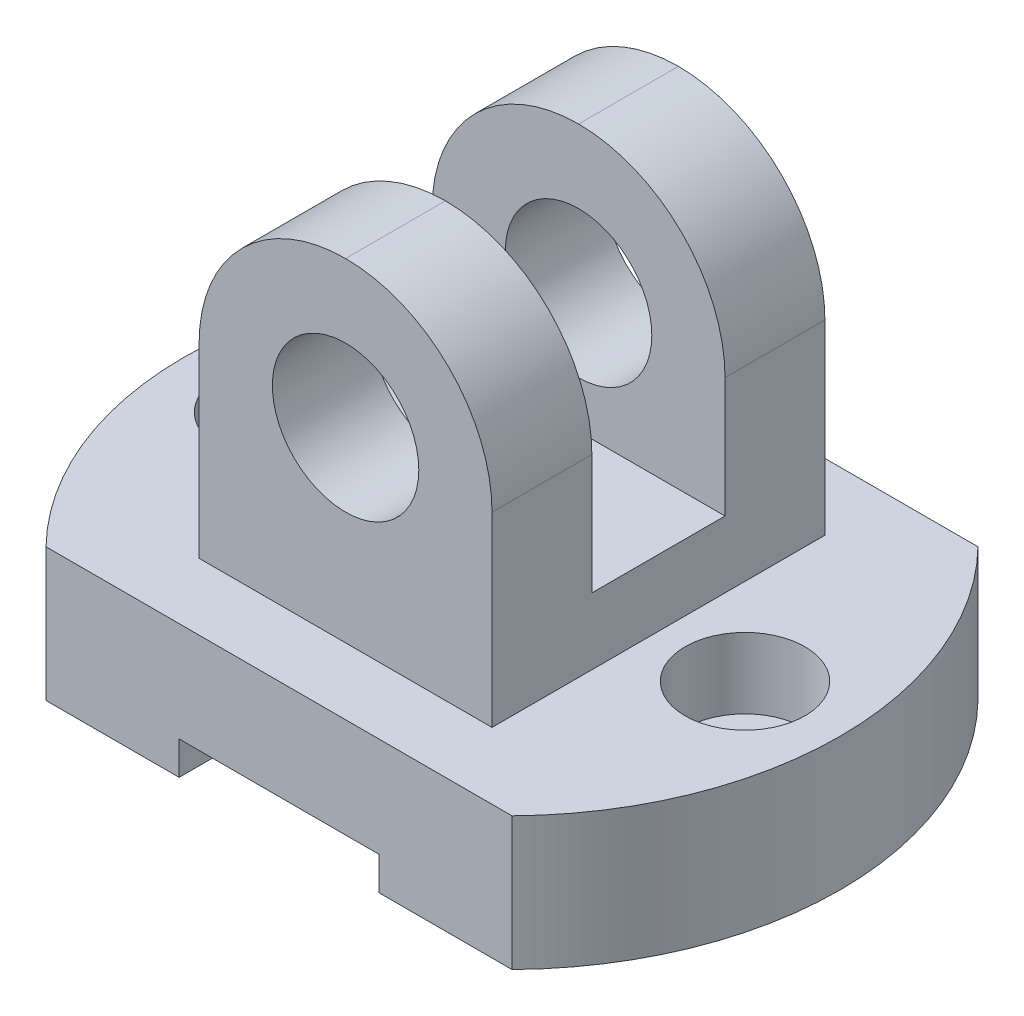
ISO-10303-21;
HEADER;
FILE_DESCRIPTION(('STEP AP214'),'2;1');
FILE_NAME('part.step','',(''),(''),'','','');
FILE_SCHEMA(('AUTOMOTIVE_DESIGN { 1 0 10303 214 1 1 1 1 }'));
ENDSEC;
DATA;
#1=APPLICATION_CONTEXT('core data for automotive mechanical design processes');
#2=APPLICATION_PROTOCOL_DEFINITION('international standard','automotive_design',2000,#1);
#3=PRODUCT_CONTEXT('',#1,'mechanical');
#4=PRODUCT('Part','Part','',(#3));
#5=PRODUCT_RELATED_PRODUCT_CATEGORY('part','',(#4));
#6=PRODUCT_DEFINITION_FORMATION('','',#4);
#7=PRODUCT_DEFINITION_CONTEXT('part definition',#1,'design');
#8=PRODUCT_DEFINITION('design','',#6,#7);
#9=PRODUCT_DEFINITION_SHAPE('','',#8);
#10=(LENGTH_UNIT() NAMED_UNIT(*) SI_UNIT(.MILLI.,.METRE.));
#11=(NAMED_UNIT(*) PLANE_ANGLE_UNIT() SI_UNIT($,.RADIAN.));
#12=(NAMED_UNIT(*) SI_UNIT($,.STERADIAN.) SOLID_ANGLE_UNIT());
#13=UNCERTAINTY_MEASURE_WITH_UNIT(LENGTH_MEASURE(1.E-05),#10,'distance_accuracy_value','');
#14=(GEOMETRIC_REPRESENTATION_CONTEXT(3) GLOBAL_UNCERTAINTY_ASSIGNED_CONTEXT((#13)) GLOBAL_UNIT_ASSIGNED_CONTEXT((#10,
#11,#12)) REPRESENTATION_CONTEXT('',''));
#15=CARTESIAN_POINT('',(0.,0.,0.));
#16=DIRECTION('',(0.,0.,1.));
#17=DIRECTION('',(1.,0.,0.));
#18=AXIS2_PLACEMENT_3D('',#15,#16,#17);
#19=CARTESIAN_POINT('',(22.,30.,0.));
#20=DIRECTION('',(0.,-1.,0.));
#21=DIRECTION('',(0.,0.,-1.));
#22=AXIS2_PLACEMENT_3D('',#19,#20,#21);
#23=PLANE('',#22);
#24=DIRECTION('',(0.,0.,1.));
#25=VECTOR('',#24,1.);
#26=CARTESIAN_POINT('',(-22.,30.,0.));
#27=LINE('',#26,#25);
#28=CARTESIAN_POINT('',(-22.,30.,-10.));
#29=VERTEX_POINT('',#28);
#30=CARTESIAN_POINT('',(-22.,30.,10.));
#31=VERTEX_POINT('',#30);
#32=EDGE_CURVE('E250',#29,#31,#27,.T.);
#33=ORIENTED_EDGE('',*,*,#32,.T.);
#34=DIRECTION('',(-1.,0.,0.));
#35=VECTOR('',#34,1.);
#36=CARTESIAN_POINT('',(22.,30.,10.));
#37=LINE('',#36,#35);
#38=CARTESIAN_POINT('',(22.,30.,10.));
#39=VERTEX_POINT('',#38);
#40=EDGE_CURVE('E267',#39,#31,#37,.T.);
#41=ORIENTED_EDGE('',*,*,#40,.F.);
#42=DIRECTION('',(0.,0.,1.));
#43=VECTOR('',#42,1.);
#44=CARTESIAN_POINT('',(22.,30.,0.));
#45=LINE('',#44,#43);
#46=CARTESIAN_POINT('',(22.,30.,-10.));
#47=VERTEX_POINT('',#46);
#48=EDGE_CURVE('E313',#47,#39,#45,.T.);
#49=ORIENTED_EDGE('',*,*,#48,.F.);
#50=DIRECTION('',(-1.,0.,0.));
#51=VECTOR('',#50,1.);
#52=CARTESIAN_POINT('',(22.,30.,-10.));
#53=LINE('',#52,#51);
#54=EDGE_CURVE('E271',#47,#29,#53,.T.);
#55=ORIENTED_EDGE('',*,*,#54,.T.);
#56=EDGE_LOOP('',(#33,#41,#49,#55));
#57=FACE_BOUND('',#56,.T.);
#58=CARTESIAN_POINT('',(0.,30.,0.));
#59=DIRECTION('',(0.,1.,0.));
#60=DIRECTION('',(0.,0.,1.));
#61=AXIS2_PLACEMENT_3D('',#58,#59,#60);
#62=CIRCLE('',#61,8.);
#63=CARTESIAN_POINT('',(0.,30.,8.));
#64=VERTEX_POINT('',#63);
#65=EDGE_CURVE('E227',#64,#64,#62,.T.);
#66=ORIENTED_EDGE('',*,*,#65,.F.);
#67=EDGE_LOOP('',(#66));
#68=FACE_BOUND('',#67,.T.);
#69=ADVANCED_FACE('F41',(#57,#68),#23,.F.);
#70=CARTESIAN_POINT('',(35.,0.,0.));
#71=DIRECTION('',(0.,1.,0.));
#72=DIRECTION('',(0.,0.,1.));
#73=AXIS2_PLACEMENT_3D('',#70,#71,#72);
#74=PLANE('',#73);
#75=CARTESIAN_POINT('',(35.,0.,0.));
#76=DIRECTION('',(0.,1.,0.));
#77=DIRECTION('',(0.,0.,1.));
#78=AXIS2_PLACEMENT_3D('',#75,#76,#77);
#79=CIRCLE('',#78,5.5);
#80=CARTESIAN_POINT('',(35.,0.,5.5));
#81=VERTEX_POINT('',#80);
#82=EDGE_CURVE('E735',#81,#81,#79,.T.);
#83=ORIENTED_EDGE('',*,*,#82,.T.);
#84=EDGE_LOOP('',(#83));
#85=FACE_BOUND('',#84,.T.);
#86=DIRECTION('',(0.,0.,1.));
#87=VECTOR('',#86,1.);
#88=CARTESIAN_POINT('',(15.,1.25466176937855E-13,-209.638659733079));
#89=LINE('',#88,#87);
#90=CARTESIAN_POINT('',(15.,0.,-35.));
#91=VERTEX_POINT('',#90);
#92=CARTESIAN_POINT('',(15.,0.,35.));
#93=VERTEX_POINT('',#92);
#94=EDGE_CURVE('E718',#91,#93,#89,.T.);
#95=ORIENTED_EDGE('',*,*,#94,.F.);
#96=DIRECTION('',(-1.,0.,0.));
#97=VECTOR('',#96,1.);
#98=CARTESIAN_POINT('',(35.,0.,-35.));
#99=LINE('',#98,#97);
#100=CARTESIAN_POINT('',(35.,0.,-35.));
#101=VERTEX_POINT('',#100);
#102=EDGE_CURVE('E194',#101,#91,#99,.T.);
#103=ORIENTED_EDGE('',*,*,#102,.F.);
#104=CARTESIAN_POINT('',(-0.707142142714244,0.,0.));
#105=DIRECTION('',(0.,-1.,0.));
#106=DIRECTION('',(0.,0.,1.));
#107=AXIS2_PLACEMENT_3D('',#104,#105,#106);
#108=CIRCLE('',#107,50.);
#109=CARTESIAN_POINT('',(35.,0.,35.));
#110=VERTEX_POINT('',#109);
#111=EDGE_CURVE('E298',#101,#110,#108,.T.);
#112=ORIENTED_EDGE('',*,*,#111,.T.);
#113=DIRECTION('',(-1.,0.,0.));
#114=VECTOR('',#113,1.);
#115=CARTESIAN_POINT('',(35.,0.,35.));
#116=LINE('',#115,#114);
#117=EDGE_CURVE('E177',#110,#93,#116,.T.);
#118=ORIENTED_EDGE('',*,*,#117,.T.);
#119=EDGE_LOOP('',(#95,#103,#112,#118));
#120=FACE_BOUND('',#119,.T.);
#121=ADVANCED_FACE('F360',(#85,#120),#74,.F.);
#122=CARTESIAN_POINT('',(35.,0.,-35.));
#123=DIRECTION('',(0.,0.,-1.));
#124=DIRECTION('',(0.,1.,0.));
#125=AXIS2_PLACEMENT_3D('',#122,#123,#124);
#126=PLANE('',#125);
#127=ORIENTED_EDGE('',*,*,#102,.T.);
#128=DIRECTION('',(0.,1.,0.));
#129=VECTOR('',#128,1.);
#130=CARTESIAN_POINT('',(15.,0.,-35.));
#131=LINE('',#130,#129);
#132=CARTESIAN_POINT('',(15.,5.,-35.));
#133=VERTEX_POINT('',#132);
#134=EDGE_CURVE('E712',#91,#133,#131,.T.);
#135=ORIENTED_EDGE('',*,*,#134,.T.);
#136=DIRECTION('',(-1.,0.,0.));
#137=VECTOR('',#136,1.);
#138=CARTESIAN_POINT('',(35.,5.,-35.));
#139=LINE('',#138,#137);
#140=CARTESIAN_POINT('',(-15.,5.00000000000013,-35.));
#141=VERTEX_POINT('',#140);
#142=EDGE_CURVE('E715',#133,#141,#139,.T.);
#143=ORIENTED_EDGE('',*,*,#142,.T.);
#144=DIRECTION('',(0.,-1.,0.));
#145=VECTOR('',#144,1.);
#146=CARTESIAN_POINT('',(-15.,0.,-35.));
#147=LINE('',#146,#145);
#148=CARTESIAN_POINT('',(-15.,0.,-35.));
#149=VERTEX_POINT('',#148);
#150=EDGE_CURVE('E294',#141,#149,#147,.T.);
#151=ORIENTED_EDGE('',*,*,#150,.T.);
#152=CARTESIAN_POINT('',(-35.,0.,-35.));
#153=VERTEX_POINT('',#152);
#154=EDGE_CURVE('E184',#149,#153,#99,.T.);
#155=ORIENTED_EDGE('',*,*,#154,.T.);
#156=DIRECTION('',(0.,-1.,0.));
#157=VECTOR('',#156,1.);
#158=CARTESIAN_POINT('',(-35.,0.,-35.));
#159=LINE('',#158,#157);
#160=CARTESIAN_POINT('',(-35.,20.,-35.));
#161=VERTEX_POINT('',#160);
#162=EDGE_CURVE('E276',#161,#153,#159,.T.);
#163=ORIENTED_EDGE('',*,*,#162,.F.);
#164=DIRECTION('',(-1.,0.,0.));
#165=VECTOR('',#164,1.);
#166=CARTESIAN_POINT('',(35.,20.,-35.));
#167=LINE('',#166,#165);
#168=CARTESIAN_POINT('',(35.,20.,-35.));
#169=VERTEX_POINT('',#168);
#170=EDGE_CURVE('E286',#169,#161,#167,.T.);
#171=ORIENTED_EDGE('',*,*,#170,.F.);
#172=DIRECTION('',(0.,-1.,0.));
#173=VECTOR('',#172,1.);
#174=CARTESIAN_POINT('',(35.,0.,-35.));
#175=LINE('',#174,#173);
#176=EDGE_CURVE('E277',#169,#101,#175,.T.);
#177=ORIENTED_EDGE('',*,*,#176,.T.);
#178=EDGE_LOOP('',(#127,#135,#143,#151,#155,#163,#171,#177));
#179=FACE_BOUND('',#178,.T.);
#180=ADVANCED_FACE('F293',(#179),#126,.T.);
#181=CARTESIAN_POINT('',(35.,0.,35.));
#182=DIRECTION('',(0.,0.,-1.));
#183=DIRECTION('',(-1.,0.,0.));
#184=AXIS2_PLACEMENT_3D('',#181,#182,#183);
#185=PLANE('',#184);
#186=DIRECTION('',(0.,1.,0.));
#187=VECTOR('',#186,1.);
#188=CARTESIAN_POINT('',(15.,0.,35.));
#189=LINE('',#188,#187);
#190=CARTESIAN_POINT('',(15.,4.99999999999996,35.));
#191=VERTEX_POINT('',#190);
#192=EDGE_CURVE('E196',#93,#191,#189,.T.);
#193=ORIENTED_EDGE('',*,*,#192,.F.);
#194=ORIENTED_EDGE('',*,*,#117,.F.);
#195=DIRECTION('',(0.,-1.,0.));
#196=VECTOR('',#195,1.);
#197=CARTESIAN_POINT('',(35.,0.,35.));
#198=LINE('',#197,#196);
#199=CARTESIAN_POINT('',(35.,20.,35.));
#200=VERTEX_POINT('',#199);
#201=EDGE_CURVE('E178',#200,#110,#198,.T.);
#202=ORIENTED_EDGE('',*,*,#201,.F.);
#203=DIRECTION('',(-1.,0.,0.));
#204=VECTOR('',#203,1.);
#205=CARTESIAN_POINT('',(35.,20.,35.));
#206=LINE('',#205,#204);
#207=CARTESIAN_POINT('',(-35.,20.,35.));
#208=VERTEX_POINT('',#207);
#209=EDGE_CURVE('E285',#200,#208,#206,.T.);
#210=ORIENTED_EDGE('',*,*,#209,.T.);
#211=DIRECTION('',(0.,-1.,0.));
#212=VECTOR('',#211,1.);
#213=CARTESIAN_POINT('',(-35.,0.,35.));
#214=LINE('',#213,#212);
#215=CARTESIAN_POINT('',(-35.,0.,35.));
#216=VERTEX_POINT('',#215);
#217=EDGE_CURVE('E173',#208,#216,#214,.T.);
#218=ORIENTED_EDGE('',*,*,#217,.T.);
#219=CARTESIAN_POINT('',(-15.,0.,35.));
#220=VERTEX_POINT('',#219);
#221=EDGE_CURVE('E166',#220,#216,#116,.T.);
#222=ORIENTED_EDGE('',*,*,#221,.F.);
#223=DIRECTION('',(0.,-1.,0.));
#224=VECTOR('',#223,1.);
#225=CARTESIAN_POINT('',(-15.,0.,35.));
#226=LINE('',#225,#224);
#227=CARTESIAN_POINT('',(-15.,5.00000000000013,35.));
#228=VERTEX_POINT('',#227);
#229=EDGE_CURVE('E170',#228,#220,#226,.T.);
#230=ORIENTED_EDGE('',*,*,#229,.F.);
#231=DIRECTION('',(-1.,0.,0.));
#232=VECTOR('',#231,1.);
#233=CARTESIAN_POINT('',(35.,4.99999999999996,35.));
#234=LINE('',#233,#232);
#235=EDGE_CURVE('E193',#191,#228,#234,.T.);
#236=ORIENTED_EDGE('',*,*,#235,.F.);
#237=EDGE_LOOP('',(#193,#194,#202,#210,#218,#222,#230,#236));
#238=FACE_BOUND('',#237,.T.);
#239=ADVANCED_FACE('F168',(#238),#185,.F.);
#240=CARTESIAN_POINT('',(35.,20.,0.));
#241=DIRECTION('',(0.,1.,0.));
#242=DIRECTION('',(0.,0.,1.));
#243=AXIS2_PLACEMENT_3D('',#240,#241,#242);
#244=PLANE('',#243);
#245=CARTESIAN_POINT('',(-35.,20.,0.));
#246=DIRECTION('',(0.,1.,0.));
#247=DIRECTION('',(0.,0.,1.));
#248=AXIS2_PLACEMENT_3D('',#245,#246,#247);
#249=CIRCLE('',#248,9.);
#250=CARTESIAN_POINT('',(-35.,20.,9.00000000000001));
#251=VERTEX_POINT('',#250);
#252=EDGE_CURVE('E756',#251,#251,#249,.T.);
#253=ORIENTED_EDGE('',*,*,#252,.F.);
#254=EDGE_LOOP('',(#253));
#255=FACE_BOUND('',#254,.T.);
#256=CARTESIAN_POINT('',(35.,20.,0.));
#257=DIRECTION('',(0.,1.,0.));
#258=DIRECTION('',(0.,0.,1.));
#259=AXIS2_PLACEMENT_3D('',#256,#257,#258);
#260=CIRCLE('',#259,9.);
#261=CARTESIAN_POINT('',(35.,20.,9.00000000000001));
#262=VERTEX_POINT('',#261);
#263=EDGE_CURVE('E744',#262,#262,#260,.T.);
#264=ORIENTED_EDGE('',*,*,#263,.F.);
#265=EDGE_LOOP('',(#264));
#266=FACE_BOUND('',#265,.T.);
#267=ORIENTED_EDGE('',*,*,#170,.T.);
#268=CARTESIAN_POINT('',(0.707142142714244,20.,0.));
#269=DIRECTION('',(0.,-1.,0.));
#270=DIRECTION('',(0.,0.,-1.));
#271=AXIS2_PLACEMENT_3D('',#268,#269,#270);
#272=CIRCLE('',#271,50.);
#273=EDGE_CURVE('E297',#208,#161,#272,.T.);
#274=ORIENTED_EDGE('',*,*,#273,.F.);
#275=ORIENTED_EDGE('',*,*,#209,.F.);
#276=CARTESIAN_POINT('',(-0.707142142714244,20.,0.));
#277=DIRECTION('',(0.,-1.,0.));
#278=DIRECTION('',(0.,0.,1.));
#279=AXIS2_PLACEMENT_3D('',#276,#277,#278);
#280=CIRCLE('',#279,50.);
#281=EDGE_CURVE('E304',#169,#200,#280,.T.);
#282=ORIENTED_EDGE('',*,*,#281,.F.);
#283=EDGE_LOOP('',(#267,#274,#275,#282));
#284=FACE_BOUND('',#283,.T.);
#285=DIRECTION('',(-1.,0.,0.));
#286=VECTOR('',#285,1.);
#287=CARTESIAN_POINT('',(22.,20.,25.));
#288=LINE('',#287,#286);
#289=CARTESIAN_POINT('',(22.,20.,25.));
#290=VERTEX_POINT('',#289);
#291=CARTESIAN_POINT('',(-22.,20.,25.));
#292=VERTEX_POINT('',#291);
#293=EDGE_CURVE('E264',#290,#292,#288,.T.);
#294=ORIENTED_EDGE('',*,*,#293,.T.);
#295=DIRECTION('',(0.,0.,-1.));
#296=VECTOR('',#295,1.);
#297=CARTESIAN_POINT('',(-22.,20.,0.));
#298=LINE('',#297,#296);
#299=CARTESIAN_POINT('',(-22.,20.,-25.));
#300=VERTEX_POINT('',#299);
#301=EDGE_CURVE('E255',#292,#300,#298,.T.);
#302=ORIENTED_EDGE('',*,*,#301,.T.);
#303=DIRECTION('',(-1.,0.,0.));
#304=VECTOR('',#303,1.);
#305=CARTESIAN_POINT('',(22.,20.,-25.));
#306=LINE('',#305,#304);
#307=CARTESIAN_POINT('',(22.,20.,-25.));
#308=VERTEX_POINT('',#307);
#309=EDGE_CURVE('E273',#308,#300,#306,.T.);
#310=ORIENTED_EDGE('',*,*,#309,.F.);
#311=DIRECTION('',(0.,0.,-1.));
#312=VECTOR('',#311,1.);
#313=CARTESIAN_POINT('',(22.,20.,0.));
#314=LINE('',#313,#312);
#315=EDGE_CURVE('E263',#290,#308,#314,.T.);
#316=ORIENTED_EDGE('',*,*,#315,.F.);
#317=EDGE_LOOP('',(#294,#302,#310,#316));
#318=FACE_BOUND('',#317,.T.);
#319=ADVANCED_FACE('F331',(#255,#266,#284,#318),#244,.T.);
#320=CARTESIAN_POINT('',(-35.,0.,0.));
#321=DIRECTION('',(0.,1.,0.));
#322=DIRECTION('',(0.,0.,1.));
#323=AXIS2_PLACEMENT_3D('',#320,#321,#322);
#324=CIRCLE('',#323,5.5);
#325=CARTESIAN_POINT('',(-35.,0.,5.5));
#326=VERTEX_POINT('',#325);
#327=EDGE_CURVE('E747',#326,#326,#324,.T.);
#328=ORIENTED_EDGE('',*,*,#327,.T.);
#329=EDGE_LOOP('',(#328));
#330=FACE_BOUND('',#329,.T.);
#331=ORIENTED_EDGE('',*,*,#154,.F.);
#332=DIRECTION('',(0.,0.,1.));
#333=VECTOR('',#332,1.);
#334=CARTESIAN_POINT('',(-15.,1.25466176937855E-13,-209.638659733079));
#335=LINE('',#334,#333);
#336=EDGE_CURVE('E182',#149,#220,#335,.T.);
#337=ORIENTED_EDGE('',*,*,#336,.T.);
#338=ORIENTED_EDGE('',*,*,#221,.T.);
#339=CARTESIAN_POINT('',(0.707142142714244,0.,0.));
#340=DIRECTION('',(0.,-1.,0.));
#341=DIRECTION('',(0.,0.,-1.));
#342=AXIS2_PLACEMENT_3D('',#339,#340,#341);
#343=CIRCLE('',#342,50.);
#344=EDGE_CURVE('E295',#216,#153,#343,.T.);
#345=ORIENTED_EDGE('',*,*,#344,.T.);
#346=EDGE_LOOP('',(#331,#337,#338,#345));
#347=FACE_BOUND('',#346,.T.);
#348=ADVANCED_FACE('F183',(#330,#347),#74,.F.);
#349=CARTESIAN_POINT('',(22.,0.,-25.));
#350=DIRECTION('',(0.,0.,-1.));
#351=DIRECTION('',(0.,1.,0.));
#352=AXIS2_PLACEMENT_3D('',#349,#350,#351);
#353=PLANE('',#352);
#354=CARTESIAN_POINT('',(0.,48.,-25.));
#355=DIRECTION('',(0.,0.,-1.));
#356=DIRECTION('',(0.,1.,0.));
#357=AXIS2_PLACEMENT_3D('',#354,#355,#356);
#358=CIRCLE('',#357,11.);
#359=CARTESIAN_POINT('',(0.,59.,-25.));
#360=VERTEX_POINT('',#359);
#361=EDGE_CURVE('E188',#360,#360,#358,.T.);
#362=ORIENTED_EDGE('',*,*,#361,.F.);
#363=EDGE_LOOP('',(#362));
#364=FACE_BOUND('',#363,.T.);
#365=CARTESIAN_POINT('',(0.,48.,-25.));
#366=DIRECTION('',(0.,0.,-1.));
#367=DIRECTION('',(0.,1.,0.));
#368=AXIS2_PLACEMENT_3D('',#365,#366,#367);
#369=CIRCLE('',#368,22.);
#370=CARTESIAN_POINT('',(-22.,48.,-25.));
#371=VERTEX_POINT('',#370);
#372=CARTESIAN_POINT('',(0.,70.,-25.));
#373=VERTEX_POINT('',#372);
#374=EDGE_CURVE('E64',#371,#373,#369,.T.);
#375=ORIENTED_EDGE('',*,*,#374,.T.);
#376=CARTESIAN_POINT('',(0.,48.,-25.));
#377=DIRECTION('',(0.,0.,-1.));
#378=DIRECTION('',(0.,1.,0.));
#379=AXIS2_PLACEMENT_3D('',#376,#377,#378);
#380=CIRCLE('',#379,22.);
#381=CARTESIAN_POINT('',(22.,48.,-25.));
#382=VERTEX_POINT('',#381);
#383=EDGE_CURVE('E223',#373,#382,#380,.T.);
#384=ORIENTED_EDGE('',*,*,#383,.T.);
#385=DIRECTION('',(0.,-1.,0.));
#386=VECTOR('',#385,1.);
#387=CARTESIAN_POINT('',(22.,0.,-25.));
#388=LINE('',#387,#386);
#389=EDGE_CURVE('E309',#382,#308,#388,.T.);
#390=ORIENTED_EDGE('',*,*,#389,.T.);
#391=ORIENTED_EDGE('',*,*,#309,.T.);
#392=DIRECTION('',(0.,-1.,0.));
#393=VECTOR('',#392,1.);
#394=CARTESIAN_POINT('',(-22.,0.,-25.));
#395=LINE('',#394,#393);
#396=EDGE_CURVE('E251',#371,#300,#395,.T.);
#397=ORIENTED_EDGE('',*,*,#396,.F.);
#398=EDGE_LOOP('',(#375,#384,#390,#391,#397));
#399=FACE_BOUND('',#398,.T.);
#400=ADVANCED_FACE('F332',(#364,#399),#353,.T.);
#401=CARTESIAN_POINT('',(22.,0.,-10.));
#402=DIRECTION('',(0.,0.,1.));
#403=DIRECTION('',(0.,-1.,0.));
#404=AXIS2_PLACEMENT_3D('',#401,#402,#403);
#405=PLANE('',#404);
#406=CARTESIAN_POINT('',(0.,48.,-10.));
#407=DIRECTION('',(0.,0.,1.));
#408=DIRECTION('',(0.,-1.,0.));
#409=AXIS2_PLACEMENT_3D('',#406,#407,#408);
#410=CIRCLE('',#409,11.);
#411=CARTESIAN_POINT('',(0.,37.,-10.));
#412=VERTEX_POINT('',#411);
#413=EDGE_CURVE('E729',#412,#412,#410,.T.);
#414=ORIENTED_EDGE('',*,*,#413,.F.);
#415=EDGE_LOOP('',(#414));
#416=FACE_BOUND('',#415,.T.);
#417=DIRECTION('',(0.,1.,0.));
#418=VECTOR('',#417,1.);
#419=CARTESIAN_POINT('',(22.,0.,-10.));
#420=LINE('',#419,#418);
#421=CARTESIAN_POINT('',(22.,48.,-9.99999999999999));
#422=VERTEX_POINT('',#421);
#423=EDGE_CURVE('E311',#47,#422,#420,.T.);
#424=ORIENTED_EDGE('',*,*,#423,.T.);
#425=CARTESIAN_POINT('',(0.,48.,-9.99999999999999));
#426=DIRECTION('',(0.,0.,1.));
#427=DIRECTION('',(0.,-1.,0.));
#428=AXIS2_PLACEMENT_3D('',#425,#426,#427);
#429=CIRCLE('',#428,22.);
#430=CARTESIAN_POINT('',(0.,70.,-9.99999999999999));
#431=VERTEX_POINT('',#430);
#432=EDGE_CURVE('E11',#422,#431,#429,.T.);
#433=ORIENTED_EDGE('',*,*,#432,.T.);
#434=CARTESIAN_POINT('',(0.,48.,-9.99999999999999));
#435=DIRECTION('',(0.,0.,1.));
#436=DIRECTION('',(0.,-1.,0.));
#437=AXIS2_PLACEMENT_3D('',#434,#435,#436);
#438=CIRCLE('',#437,22.);
#439=CARTESIAN_POINT('',(-22.,48.,-9.99999999999999));
#440=VERTEX_POINT('',#439);
#441=EDGE_CURVE('E50',#431,#440,#438,.T.);
#442=ORIENTED_EDGE('',*,*,#441,.T.);
#443=DIRECTION('',(0.,1.,0.));
#444=VECTOR('',#443,1.);
#445=CARTESIAN_POINT('',(-22.,0.,-10.));
#446=LINE('',#445,#444);
#447=EDGE_CURVE('E244',#29,#440,#446,.T.);
#448=ORIENTED_EDGE('',*,*,#447,.F.);
#449=ORIENTED_EDGE('',*,*,#54,.F.);
#450=EDGE_LOOP('',(#424,#433,#442,#448,#449));
#451=FACE_BOUND('',#450,.T.);
#452=ADVANCED_FACE('F243',(#416,#451),#405,.T.);
#453=CARTESIAN_POINT('',(22.,0.,10.));
#454=DIRECTION('',(0.,0.,1.));
#455=DIRECTION('',(1.,0.,0.));
#456=AXIS2_PLACEMENT_3D('',#453,#454,#455);
#457=PLANE('',#456);
#458=CARTESIAN_POINT('',(0.,48.,10.));
#459=DIRECTION('',(0.,0.,1.));
#460=DIRECTION('',(1.,0.,0.));
#461=AXIS2_PLACEMENT_3D('',#458,#459,#460);
#462=CIRCLE('',#461,11.);
#463=CARTESIAN_POINT('',(11.,48.,10.));
#464=VERTEX_POINT('',#463);
#465=EDGE_CURVE('E727',#464,#464,#462,.T.);
#466=ORIENTED_EDGE('',*,*,#465,.T.);
#467=EDGE_LOOP('',(#466));
#468=FACE_BOUND('',#467,.T.);
#469=DIRECTION('',(0.,1.,0.));
#470=VECTOR('',#469,1.);
#471=CARTESIAN_POINT('',(-22.,0.,10.));
#472=LINE('',#471,#470);
#473=CARTESIAN_POINT('',(-22.,48.,10.));
#474=VERTEX_POINT('',#473);
#475=EDGE_CURVE('E253',#31,#474,#472,.T.);
#476=ORIENTED_EDGE('',*,*,#475,.T.);
#477=CARTESIAN_POINT('',(0.,48.,10.));
#478=DIRECTION('',(0.,0.,1.));
#479=DIRECTION('',(1.,0.,0.));
#480=AXIS2_PLACEMENT_3D('',#477,#478,#479);
#481=CIRCLE('',#480,22.);
#482=CARTESIAN_POINT('',(0.,70.,10.));
#483=VERTEX_POINT('',#482);
#484=EDGE_CURVE('E215',#474,#483,#481,.F.);
#485=ORIENTED_EDGE('',*,*,#484,.T.);
#486=CARTESIAN_POINT('',(0.,48.,10.));
#487=DIRECTION('',(0.,0.,1.));
#488=DIRECTION('',(1.,0.,0.));
#489=AXIS2_PLACEMENT_3D('',#486,#487,#488);
#490=CIRCLE('',#489,22.);
#491=CARTESIAN_POINT('',(22.,48.,10.));
#492=VERTEX_POINT('',#491);
#493=EDGE_CURVE('E213',#483,#492,#490,.F.);
#494=ORIENTED_EDGE('',*,*,#493,.T.);
#495=DIRECTION('',(0.,1.,0.));
#496=VECTOR('',#495,1.);
#497=CARTESIAN_POINT('',(22.,0.,10.));
#498=LINE('',#497,#496);
#499=EDGE_CURVE('E315',#39,#492,#498,.T.);
#500=ORIENTED_EDGE('',*,*,#499,.F.);
#501=ORIENTED_EDGE('',*,*,#40,.T.);
#502=EDGE_LOOP('',(#476,#485,#494,#500,#501));
#503=FACE_BOUND('',#502,.T.);
#504=ADVANCED_FACE('F345',(#468,#503),#457,.F.);
#505=CARTESIAN_POINT('',(22.,0.,25.));
#506=DIRECTION('',(0.,0.,-1.));
#507=DIRECTION('',(0.,1.,0.));
#508=AXIS2_PLACEMENT_3D('',#505,#506,#507);
#509=PLANE('',#508);
#510=CARTESIAN_POINT('',(0.,48.,25.));
#511=DIRECTION('',(0.,0.,1.));
#512=DIRECTION('',(1.,0.,0.));
#513=AXIS2_PLACEMENT_3D('',#510,#511,#512);
#514=CIRCLE('',#513,11.);
#515=CARTESIAN_POINT('',(11.,48.,25.));
#516=VERTEX_POINT('',#515);
#517=EDGE_CURVE('E732',#516,#516,#514,.T.);
#518=ORIENTED_EDGE('',*,*,#517,.F.);
#519=EDGE_LOOP('',(#518));
#520=FACE_BOUND('',#519,.T.);
#521=CARTESIAN_POINT('',(0.,48.,25.));
#522=DIRECTION('',(0.,0.,-1.));
#523=DIRECTION('',(0.,1.,0.));
#524=AXIS2_PLACEMENT_3D('',#521,#522,#523);
#525=CIRCLE('',#524,22.);
#526=CARTESIAN_POINT('',(22.,48.,25.));
#527=VERTEX_POINT('',#526);
#528=CARTESIAN_POINT('',(0.,70.,25.));
#529=VERTEX_POINT('',#528);
#530=EDGE_CURVE('E204',#527,#529,#525,.F.);
#531=ORIENTED_EDGE('',*,*,#530,.T.);
#532=CARTESIAN_POINT('',(0.,48.,25.));
#533=DIRECTION('',(0.,0.,-1.));
#534=DIRECTION('',(0.,1.,0.));
#535=AXIS2_PLACEMENT_3D('',#532,#533,#534);
#536=CIRCLE('',#535,22.);
#537=CARTESIAN_POINT('',(-22.,48.,25.));
#538=VERTEX_POINT('',#537);
#539=EDGE_CURVE('E206',#529,#538,#536,.F.);
#540=ORIENTED_EDGE('',*,*,#539,.T.);
#541=DIRECTION('',(0.,-1.,0.));
#542=VECTOR('',#541,1.);
#543=CARTESIAN_POINT('',(-22.,0.,25.));
#544=LINE('',#543,#542);
#545=EDGE_CURVE('E261',#538,#292,#544,.T.);
#546=ORIENTED_EDGE('',*,*,#545,.T.);
#547=ORIENTED_EDGE('',*,*,#293,.F.);
#548=DIRECTION('',(0.,-1.,0.));
#549=VECTOR('',#548,1.);
#550=CARTESIAN_POINT('',(22.,0.,25.));
#551=LINE('',#550,#549);
#552=EDGE_CURVE('E268',#527,#290,#551,.T.);
#553=ORIENTED_EDGE('',*,*,#552,.F.);
#554=EDGE_LOOP('',(#531,#540,#546,#547,#553));
#555=FACE_BOUND('',#554,.T.);
#556=ADVANCED_FACE('F328',(#520,#555),#509,.F.);
#557=CARTESIAN_POINT('',(22.,0.,0.));
#558=DIRECTION('',(1.,0.,0.));
#559=DIRECTION('',(0.,0.,-1.));
#560=AXIS2_PLACEMENT_3D('',#557,#558,#559);
#561=PLANE('',#560);
#562=ORIENTED_EDGE('',*,*,#499,.T.);
#563=DIRECTION('',(0.,0.,1.));
#564=VECTOR('',#563,1.);
#565=CARTESIAN_POINT('',(22.,48.,25.));
#566=LINE('',#565,#564);
#567=EDGE_CURVE('E220',#492,#527,#566,.T.);
#568=ORIENTED_EDGE('',*,*,#567,.T.);
#569=ORIENTED_EDGE('',*,*,#552,.T.);
#570=ORIENTED_EDGE('',*,*,#315,.T.);
#571=ORIENTED_EDGE('',*,*,#389,.F.);
#572=DIRECTION('',(0.,0.,-1.));
#573=VECTOR('',#572,1.);
#574=CARTESIAN_POINT('',(22.,48.,0.));
#575=LINE('',#574,#573);
#576=EDGE_CURVE('E217',#382,#422,#575,.F.);
#577=ORIENTED_EDGE('',*,*,#576,.T.);
#578=ORIENTED_EDGE('',*,*,#423,.F.);
#579=ORIENTED_EDGE('',*,*,#48,.T.);
#580=EDGE_LOOP('',(#562,#568,#569,#570,#571,#577,#578,#579));
#581=FACE_BOUND('',#580,.T.);
#582=ADVANCED_FACE('F321',(#581),#561,.T.);
#583=CARTESIAN_POINT('',(-22.,0.,0.));
#584=DIRECTION('',(1.,0.,0.));
#585=DIRECTION('',(0.,0.,-1.));
#586=AXIS2_PLACEMENT_3D('',#583,#584,#585);
#587=PLANE('',#586);
#588=ORIENTED_EDGE('',*,*,#545,.F.);
#589=DIRECTION('',(0.,0.,1.));
#590=VECTOR('',#589,1.);
#591=CARTESIAN_POINT('',(-22.,48.,0.));
#592=LINE('',#591,#590);
#593=EDGE_CURVE('E210',#538,#474,#592,.F.);
#594=ORIENTED_EDGE('',*,*,#593,.T.);
#595=ORIENTED_EDGE('',*,*,#475,.F.);
#596=ORIENTED_EDGE('',*,*,#32,.F.);
#597=ORIENTED_EDGE('',*,*,#447,.T.);
#598=DIRECTION('',(0.,0.,-1.));
#599=VECTOR('',#598,1.);
#600=CARTESIAN_POINT('',(-22.,48.,-25.));
#601=LINE('',#600,#599);
#602=EDGE_CURVE('E208',#440,#371,#601,.T.);
#603=ORIENTED_EDGE('',*,*,#602,.T.);
#604=ORIENTED_EDGE('',*,*,#396,.T.);
#605=ORIENTED_EDGE('',*,*,#301,.F.);
#606=EDGE_LOOP('',(#588,#594,#595,#596,#597,#603,#604,#605));
#607=FACE_BOUND('',#606,.T.);
#608=ADVANCED_FACE('F248',(#607),#587,.F.);
#609=CARTESIAN_POINT('',(0.707142142714244,20.,0.));
#610=DIRECTION('',(0.,-1.,0.));
#611=DIRECTION('',(0.,0.,-1.));
#612=AXIS2_PLACEMENT_3D('',#609,#610,#611);
#613=CYLINDRICAL_SURFACE('',#612,50.);
#614=ORIENTED_EDGE('',*,*,#344,.F.);
#615=ORIENTED_EDGE('',*,*,#217,.F.);
#616=ORIENTED_EDGE('',*,*,#273,.T.);
#617=ORIENTED_EDGE('',*,*,#162,.T.);
#618=EDGE_LOOP('',(#614,#615,#616,#617));
#619=FACE_BOUND('',#618,.T.);
#620=ADVANCED_FACE('F300',(#619),#613,.T.);
#621=CARTESIAN_POINT('',(-0.707142142714244,20.,0.));
#622=DIRECTION('',(0.,-1.,0.));
#623=DIRECTION('',(0.,0.,-1.));
#624=AXIS2_PLACEMENT_3D('',#621,#622,#623);
#625=CYLINDRICAL_SURFACE('',#624,50.);
#626=ORIENTED_EDGE('',*,*,#111,.F.);
#627=ORIENTED_EDGE('',*,*,#176,.F.);
#628=ORIENTED_EDGE('',*,*,#281,.T.);
#629=ORIENTED_EDGE('',*,*,#201,.T.);
#630=EDGE_LOOP('',(#626,#627,#628,#629));
#631=FACE_BOUND('',#630,.T.);
#632=ADVANCED_FACE('F492',(#631),#625,.T.);
#633=CARTESIAN_POINT('',(15.,1.25466176937855E-13,-209.638659733079));
#634=DIRECTION('',(-1.,0.,0.));
#635=DIRECTION('',(0.,0.,1.));
#636=AXIS2_PLACEMENT_3D('',#633,#634,#635);
#637=PLANE('',#636);
#638=ORIENTED_EDGE('',*,*,#134,.F.);
#639=ORIENTED_EDGE('',*,*,#94,.T.);
#640=ORIENTED_EDGE('',*,*,#192,.T.);
#641=DIRECTION('',(0.,0.,1.));
#642=VECTOR('',#641,1.);
#643=CARTESIAN_POINT('',(15.,5.00000000000013,-209.638659733079));
#644=LINE('',#643,#642);
#645=EDGE_CURVE('E721',#133,#191,#644,.T.);
#646=ORIENTED_EDGE('',*,*,#645,.F.);
#647=EDGE_LOOP('',(#638,#639,#640,#646));
#648=FACE_BOUND('',#647,.T.);
#649=ADVANCED_FACE('F485',(#648),#637,.T.);
#650=CARTESIAN_POINT('',(15.,5.00000000000013,-209.638659733079));
#651=DIRECTION('',(0.,-1.,0.));
#652=DIRECTION('',(0.,0.,-1.));
#653=AXIS2_PLACEMENT_3D('',#650,#651,#652);
#654=PLANE('',#653);
#655=CARTESIAN_POINT('',(0.,4.99999999999998,0.));
#656=DIRECTION('',(0.,-1.,0.));
#657=DIRECTION('',(0.,0.,-1.));
#658=AXIS2_PLACEMENT_3D('',#655,#656,#657);
#659=CIRCLE('',#658,7.99999999999999);
#660=CARTESIAN_POINT('',(0.,4.99999999999999,-7.99999999999999));
#661=VERTEX_POINT('',#660);
#662=EDGE_CURVE('E232',#661,#661,#659,.T.);
#663=ORIENTED_EDGE('',*,*,#662,.F.);
#664=EDGE_LOOP('',(#663));
#665=FACE_BOUND('',#664,.T.);
#666=ORIENTED_EDGE('',*,*,#142,.F.);
#667=ORIENTED_EDGE('',*,*,#645,.T.);
#668=ORIENTED_EDGE('',*,*,#235,.T.);
#669=DIRECTION('',(0.,0.,1.));
#670=VECTOR('',#669,1.);
#671=CARTESIAN_POINT('',(-15.,5.00000000000013,-209.638659733079));
#672=LINE('',#671,#670);
#673=EDGE_CURVE('E187',#141,#228,#672,.T.);
#674=ORIENTED_EDGE('',*,*,#673,.F.);
#675=EDGE_LOOP('',(#666,#667,#668,#674));
#676=FACE_BOUND('',#675,.T.);
#677=ADVANCED_FACE('F478',(#665,#676),#654,.T.);
#678=CARTESIAN_POINT('',(-15.,1.25466176937855E-13,-209.638659733079));
#679=DIRECTION('',(1.,0.,0.));
#680=DIRECTION('',(0.,0.,-1.));
#681=AXIS2_PLACEMENT_3D('',#678,#679,#680);
#682=PLANE('',#681);
#683=ORIENTED_EDGE('',*,*,#150,.F.);
#684=ORIENTED_EDGE('',*,*,#673,.T.);
#685=ORIENTED_EDGE('',*,*,#229,.T.);
#686=ORIENTED_EDGE('',*,*,#336,.F.);
#687=EDGE_LOOP('',(#683,#684,#685,#686));
#688=FACE_BOUND('',#687,.T.);
#689=ADVANCED_FACE('F191',(#688),#682,.T.);
#690=CARTESIAN_POINT('',(0.,48.,25.));
#691=DIRECTION('',(0.,0.,1.));
#692=DIRECTION('',(1.,0.,0.));
#693=AXIS2_PLACEMENT_3D('',#690,#691,#692);
#694=CYLINDRICAL_SURFACE('',#693,11.);
#695=ORIENTED_EDGE('',*,*,#517,.T.);
#696=EDGE_LOOP('',(#695));
#697=FACE_BOUND('',#696,.T.);
#698=ORIENTED_EDGE('',*,*,#465,.F.);
#699=EDGE_LOOP('',(#698));
#700=FACE_BOUND('',#699,.T.);
#701=ADVANCED_FACE('F463',(#697,#700),#694,.F.);
#702=ORIENTED_EDGE('',*,*,#361,.T.);
#703=EDGE_LOOP('',(#702));
#704=FACE_BOUND('',#703,.T.);
#705=ORIENTED_EDGE('',*,*,#413,.T.);
#706=EDGE_LOOP('',(#705));
#707=FACE_BOUND('',#706,.T.);
#708=ADVANCED_FACE('F454',(#704,#707),#694,.F.);
#709=CARTESIAN_POINT('',(35.,20.,0.));
#710=DIRECTION('',(0.,1.,0.));
#711=DIRECTION('',(0.,0.,1.));
#712=AXIS2_PLACEMENT_3D('',#709,#710,#711);
#713=CYLINDRICAL_SURFACE('',#712,5.5);
#714=ORIENTED_EDGE('',*,*,#82,.F.);
#715=EDGE_LOOP('',(#714));
#716=FACE_BOUND('',#715,.T.);
#717=CARTESIAN_POINT('',(35.,9.4,0.));
#718=DIRECTION('',(0.,1.,0.));
#719=DIRECTION('',(0.,0.,1.));
#720=AXIS2_PLACEMENT_3D('',#717,#718,#719);
#721=CIRCLE('',#720,5.5);
#722=CARTESIAN_POINT('',(35.,9.4,5.5));
#723=VERTEX_POINT('',#722);
#724=EDGE_CURVE('E738',#723,#723,#721,.T.);
#725=ORIENTED_EDGE('',*,*,#724,.T.);
#726=EDGE_LOOP('',(#725));
#727=FACE_BOUND('',#726,.T.);
#728=ADVANCED_FACE('F446',(#716,#727),#713,.F.);
#729=CARTESIAN_POINT('',(40.5,9.4,0.));
#730=DIRECTION('',(0.,-1.,0.));
#731=DIRECTION('',(0.,0.,-1.));
#732=AXIS2_PLACEMENT_3D('',#729,#730,#731);
#733=PLANE('',#732);
#734=ORIENTED_EDGE('',*,*,#724,.F.);
#735=EDGE_LOOP('',(#734));
#736=FACE_BOUND('',#735,.T.);
#737=CARTESIAN_POINT('',(35.,9.4,0.));
#738=DIRECTION('',(0.,1.,0.));
#739=DIRECTION('',(0.,0.,1.));
#740=AXIS2_PLACEMENT_3D('',#737,#738,#739);
#741=CIRCLE('',#740,9.);
#742=CARTESIAN_POINT('',(35.,9.4,9.00000000000001));
#743=VERTEX_POINT('',#742);
#744=EDGE_CURVE('E741',#743,#743,#741,.T.);
#745=ORIENTED_EDGE('',*,*,#744,.T.);
#746=EDGE_LOOP('',(#745));
#747=FACE_BOUND('',#746,.T.);
#748=ADVANCED_FACE('F438',(#736,#747),#733,.F.);
#749=CARTESIAN_POINT('',(35.,20.,0.));
#750=DIRECTION('',(0.,1.,0.));
#751=DIRECTION('',(0.,0.,1.));
#752=AXIS2_PLACEMENT_3D('',#749,#750,#751);
#753=CYLINDRICAL_SURFACE('',#752,9.);
#754=ORIENTED_EDGE('',*,*,#744,.F.);
#755=EDGE_LOOP('',(#754));
#756=FACE_BOUND('',#755,.T.);
#757=ORIENTED_EDGE('',*,*,#263,.T.);
#758=EDGE_LOOP('',(#757));
#759=FACE_BOUND('',#758,.T.);
#760=ADVANCED_FACE('F430',(#756,#759),#753,.F.);
#761=CARTESIAN_POINT('',(-35.,20.,0.));
#762=DIRECTION('',(0.,1.,0.));
#763=DIRECTION('',(0.,0.,1.));
#764=AXIS2_PLACEMENT_3D('',#761,#762,#763);
#765=CYLINDRICAL_SURFACE('',#764,5.5);
#766=ORIENTED_EDGE('',*,*,#327,.F.);
#767=EDGE_LOOP('',(#766));
#768=FACE_BOUND('',#767,.T.);
#769=CARTESIAN_POINT('',(-35.,9.4,0.));
#770=DIRECTION('',(0.,1.,0.));
#771=DIRECTION('',(0.,0.,1.));
#772=AXIS2_PLACEMENT_3D('',#769,#770,#771);
#773=CIRCLE('',#772,5.5);
#774=CARTESIAN_POINT('',(-35.,9.4,5.5));
#775=VERTEX_POINT('',#774);
#776=EDGE_CURVE('E750',#775,#775,#773,.T.);
#777=ORIENTED_EDGE('',*,*,#776,.T.);
#778=EDGE_LOOP('',(#777));
#779=FACE_BOUND('',#778,.T.);
#780=ADVANCED_FACE('F422',(#768,#779),#765,.F.);
#781=CARTESIAN_POINT('',(-29.5,9.4,0.));
#782=DIRECTION('',(0.,-1.,0.));
#783=DIRECTION('',(0.,0.,-1.));
#784=AXIS2_PLACEMENT_3D('',#781,#782,#783);
#785=PLANE('',#784);
#786=ORIENTED_EDGE('',*,*,#776,.F.);
#787=EDGE_LOOP('',(#786));
#788=FACE_BOUND('',#787,.T.);
#789=CARTESIAN_POINT('',(-35.,9.4,0.));
#790=DIRECTION('',(0.,1.,0.));
#791=DIRECTION('',(0.,0.,1.));
#792=AXIS2_PLACEMENT_3D('',#789,#790,#791);
#793=CIRCLE('',#792,9.);
#794=CARTESIAN_POINT('',(-35.,9.4,9.00000000000001));
#795=VERTEX_POINT('',#794);
#796=EDGE_CURVE('E753',#795,#795,#793,.T.);
#797=ORIENTED_EDGE('',*,*,#796,.T.);
#798=EDGE_LOOP('',(#797));
#799=FACE_BOUND('',#798,.T.);
#800=ADVANCED_FACE('F414',(#788,#799),#785,.F.);
#801=CARTESIAN_POINT('',(-35.,20.,0.));
#802=DIRECTION('',(0.,1.,0.));
#803=DIRECTION('',(0.,0.,1.));
#804=AXIS2_PLACEMENT_3D('',#801,#802,#803);
#805=CYLINDRICAL_SURFACE('',#804,9.);
#806=ORIENTED_EDGE('',*,*,#796,.F.);
#807=EDGE_LOOP('',(#806));
#808=FACE_BOUND('',#807,.T.);
#809=ORIENTED_EDGE('',*,*,#252,.T.);
#810=EDGE_LOOP('',(#809));
#811=FACE_BOUND('',#810,.T.);
#812=ADVANCED_FACE('F404',(#808,#811),#805,.F.);
#813=CARTESIAN_POINT('',(0.,30.,0.));
#814=DIRECTION('',(0.,1.,0.));
#815=DIRECTION('',(0.,0.,1.));
#816=AXIS2_PLACEMENT_3D('',#813,#814,#815);
#817=CYLINDRICAL_SURFACE('',#816,7.99999999999999);
#818=ORIENTED_EDGE('',*,*,#65,.T.);
#819=EDGE_LOOP('',(#818));
#820=FACE_BOUND('',#819,.T.);
#821=ORIENTED_EDGE('',*,*,#662,.T.);
#822=EDGE_LOOP('',(#821));
#823=FACE_BOUND('',#822,.T.);
#824=ADVANCED_FACE('F382',(#820,#823),#817,.F.);
#825=CARTESIAN_POINT('',(0.,48.,0.));
#826=DIRECTION('',(0.,0.,-1.));
#827=DIRECTION('',(-1.,0.,0.));
#828=AXIS2_PLACEMENT_3D('',#825,#826,#827);
#829=CYLINDRICAL_SURFACE('',#828,22.);
#830=ORIENTED_EDGE('',*,*,#567,.F.);
#831=ORIENTED_EDGE('',*,*,#493,.F.);
#832=DIRECTION('',(0.,0.,1.));
#833=VECTOR('',#832,1.);
#834=CARTESIAN_POINT('',(0.,70.,10.));
#835=LINE('',#834,#833);
#836=EDGE_CURVE('E225',#529,#483,#835,.F.);
#837=ORIENTED_EDGE('',*,*,#836,.F.);
#838=ORIENTED_EDGE('',*,*,#530,.F.);
#839=EDGE_LOOP('',(#830,#831,#837,#838));
#840=FACE_BOUND('',#839,.T.);
#841=ADVANCED_FACE('F342',(#840),#829,.T.);
#842=CARTESIAN_POINT('',(0.,48.,0.));
#843=DIRECTION('',(0.,0.,1.));
#844=DIRECTION('',(1.,0.,0.));
#845=AXIS2_PLACEMENT_3D('',#842,#843,#844);
#846=CYLINDRICAL_SURFACE('',#845,22.);
#847=ORIENTED_EDGE('',*,*,#484,.F.);
#848=ORIENTED_EDGE('',*,*,#593,.F.);
#849=ORIENTED_EDGE('',*,*,#539,.F.);
#850=ORIENTED_EDGE('',*,*,#836,.T.);
#851=EDGE_LOOP('',(#847,#848,#849,#850));
#852=FACE_BOUND('',#851,.T.);
#853=ADVANCED_FACE('F344',(#852),#846,.T.);
#854=CARTESIAN_POINT('',(0.,48.,0.));
#855=DIRECTION('',(0.,0.,1.));
#856=DIRECTION('',(1.,0.,0.));
#857=AXIS2_PLACEMENT_3D('',#854,#855,#856);
#858=CYLINDRICAL_SURFACE('',#857,22.);
#859=ORIENTED_EDGE('',*,*,#602,.F.);
#860=ORIENTED_EDGE('',*,*,#441,.F.);
#861=DIRECTION('',(0.,0.,-1.));
#862=VECTOR('',#861,1.);
#863=CARTESIAN_POINT('',(0.,70.,-9.99999999999999));
#864=LINE('',#863,#862);
#865=EDGE_CURVE('E45',#373,#431,#864,.F.);
#866=ORIENTED_EDGE('',*,*,#865,.F.);
#867=ORIENTED_EDGE('',*,*,#374,.F.);
#868=EDGE_LOOP('',(#859,#860,#866,#867));
#869=FACE_BOUND('',#868,.T.);
#870=ADVANCED_FACE('F43',(#869),#858,.T.);
#871=CARTESIAN_POINT('',(0.,48.,0.));
#872=DIRECTION('',(0.,0.,-1.));
#873=DIRECTION('',(-1.,0.,0.));
#874=AXIS2_PLACEMENT_3D('',#871,#872,#873);
#875=CYLINDRICAL_SURFACE('',#874,22.);
#876=ORIENTED_EDGE('',*,*,#432,.F.);
#877=ORIENTED_EDGE('',*,*,#576,.F.);
#878=ORIENTED_EDGE('',*,*,#383,.F.);
#879=ORIENTED_EDGE('',*,*,#865,.T.);
#880=EDGE_LOOP('',(#876,#877,#878,#879));
#881=FACE_BOUND('',#880,.T.);
#882=ADVANCED_FACE('F237',(#881),#875,.T.);
#883=CLOSED_SHELL('',(#69,#121,#180,#239,#319,#348,#400,#452,#504,#556,#582,#608,#620,#632,#649,
#677,#689,#701,#708,#728,#748,#760,#780,#800,#812,#824,#841,#853,#870,#882));
#884=MANIFOLD_SOLID_BREP('B2',#883);
#885=ADVANCED_BREP_SHAPE_REPRESENTATION('',(#18,#884),#14);
#886=SHAPE_DEFINITION_REPRESENTATION(#9,#885);
ENDSEC;
END-ISO-10303-21;
